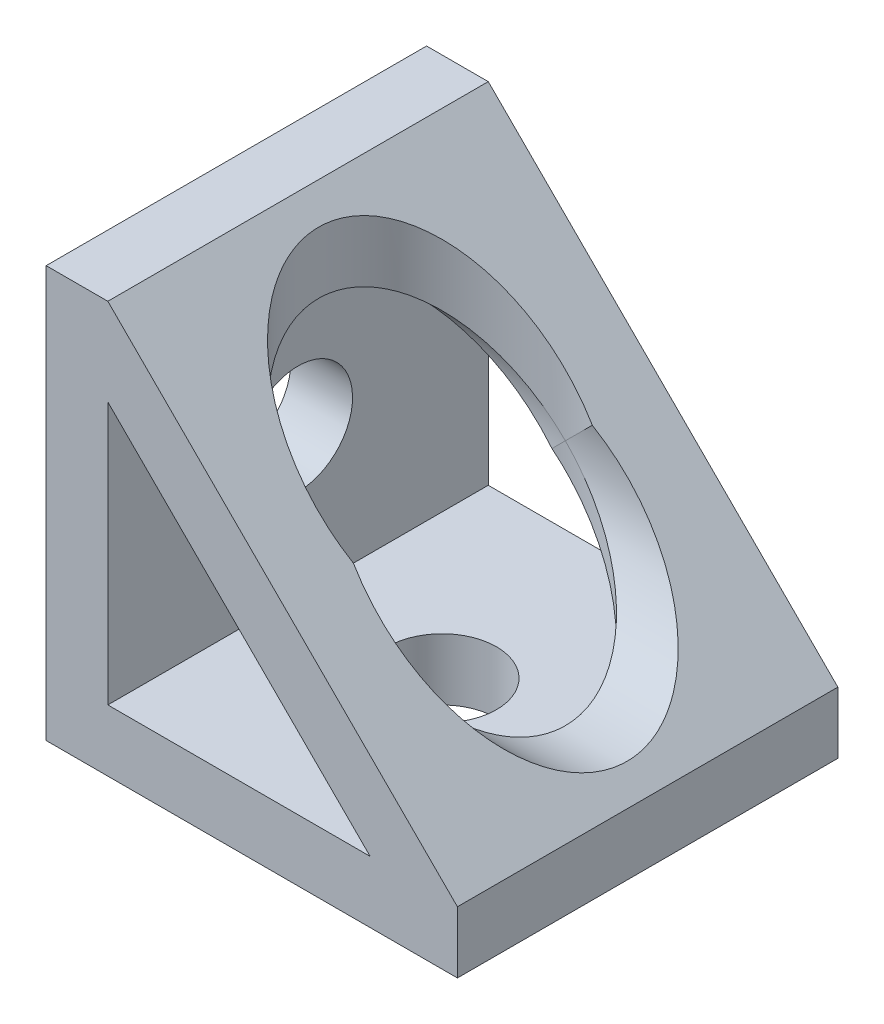
ISO-10303-21;
HEADER;
FILE_DESCRIPTION(('STEP AP214'),'2;1');
FILE_NAME('part.step','',(''),(''),'','','');
FILE_SCHEMA(('AUTOMOTIVE_DESIGN { 1 0 10303 214 1 1 1 1 }'));
ENDSEC;
DATA;
#1=APPLICATION_CONTEXT('core data for automotive mechanical design processes');
#2=APPLICATION_PROTOCOL_DEFINITION('international standard','automotive_design',2000,#1);
#3=PRODUCT_CONTEXT('',#1,'mechanical');
#4=PRODUCT('Part','Part','',(#3));
#5=PRODUCT_RELATED_PRODUCT_CATEGORY('part','',(#4));
#6=PRODUCT_DEFINITION_FORMATION('','',#4);
#7=PRODUCT_DEFINITION_CONTEXT('part definition',#1,'design');
#8=PRODUCT_DEFINITION('design','',#6,#7);
#9=PRODUCT_DEFINITION_SHAPE('','',#8);
#10=(LENGTH_UNIT() NAMED_UNIT(*) SI_UNIT(.MILLI.,.METRE.));
#11=(NAMED_UNIT(*) PLANE_ANGLE_UNIT() SI_UNIT($,.RADIAN.));
#12=(NAMED_UNIT(*) SI_UNIT($,.STERADIAN.) SOLID_ANGLE_UNIT());
#13=UNCERTAINTY_MEASURE_WITH_UNIT(LENGTH_MEASURE(1.E-05),#10,'distance_accuracy_value','');
#14=(GEOMETRIC_REPRESENTATION_CONTEXT(3) GLOBAL_UNCERTAINTY_ASSIGNED_CONTEXT((#13)) GLOBAL_UNIT_ASSIGNED_CONTEXT((#10,
#11,#12)) REPRESENTATION_CONTEXT('',''));
#15=CARTESIAN_POINT('',(0.,0.,0.));
#16=DIRECTION('',(0.,0.,1.));
#17=DIRECTION('',(1.,0.,0.));
#18=AXIS2_PLACEMENT_3D('',#15,#16,#17);
#19=CARTESIAN_POINT('',(5.75735931288072,-7.,-9.25));
#20=DIRECTION('',(0.707106781186547,0.707106781186547,0.));
#21=DIRECTION('',(-0.707106781186548,0.707106781186548,0.));
#22=AXIS2_PLACEMENT_3D('',#19,#20,#21);
#23=PLANE('',#22);
#24=DIRECTION('',(0.,0.,1.));
#25=VECTOR('',#24,1.);
#26=CARTESIAN_POINT('',(-7.,5.75735931288071,-9.25));
#27=LINE('',#26,#25);
#28=CARTESIAN_POINT('',(-7.,5.75735931288071,1.68902745459798));
#29=VERTEX_POINT('',#28);
#30=CARTESIAN_POINT('',(-7.,5.75735931288071,9.25));
#31=VERTEX_POINT('',#30);
#32=EDGE_CURVE('E143',#29,#31,#27,.T.);
#33=ORIENTED_EDGE('',*,*,#32,.F.);
#34=CARTESIAN_POINT('',(-1.24264068711928,0.,0.));
#35=DIRECTION('',(0.707106781186547,0.707106781186547,0.));
#36=DIRECTION('',(-0.707106781186548,0.707106781186548,0.));
#37=AXIS2_PLACEMENT_3D('',#34,#35,#36);
#38=ELLIPSE('',#37,8.48528137423857,6.);
#39=CARTESIAN_POINT('',(-0.621320343559641,-0.621320343559641,5.96774337842027));
#40=VERTEX_POINT('',#39);
#41=EDGE_CURVE('E126',#29,#40,#38,.T.);
#42=ORIENTED_EDGE('',*,*,#41,.T.);
#43=CARTESIAN_POINT('',(0.,-1.24264068711928,0.));
#44=DIRECTION('',(0.707106781186547,0.707106781186547,0.));
#45=DIRECTION('',(0.707106781186548,-0.707106781186548,0.));
#46=AXIS2_PLACEMENT_3D('',#43,#44,#45);
#47=ELLIPSE('',#46,8.48528137423857,6.);
#48=CARTESIAN_POINT('',(5.75735931288072,-7.,1.68902745459797));
#49=VERTEX_POINT('',#48);
#50=EDGE_CURVE('E206',#49,#40,#47,.F.);
#51=ORIENTED_EDGE('',*,*,#50,.F.);
#52=DIRECTION('',(0.,0.,1.));
#53=VECTOR('',#52,1.);
#54=CARTESIAN_POINT('',(5.75735931288072,-7.,-9.25));
#55=LINE('',#54,#53);
#56=CARTESIAN_POINT('',(5.75735931288072,-7.,9.25));
#57=VERTEX_POINT('',#56);
#58=EDGE_CURVE('E243',#49,#57,#55,.T.);
#59=ORIENTED_EDGE('',*,*,#58,.T.);
#60=DIRECTION('',(-0.707106781186547,0.707106781186547,0.));
#61=VECTOR('',#60,1.);
#62=CARTESIAN_POINT('',(5.75735931288072,-7.,9.25));
#63=LINE('',#62,#61);
#64=EDGE_CURVE('E150',#57,#31,#63,.T.);
#65=ORIENTED_EDGE('',*,*,#64,.T.);
#66=EDGE_LOOP('',(#33,#42,#51,#59,#65));
#67=FACE_BOUND('',#66,.T.);
#68=ADVANCED_FACE('F34',(#67),#23,.F.);
#69=CARTESIAN_POINT('',(0.,10.,0.));
#70=DIRECTION('',(0.,-1.,0.));
#71=DIRECTION('',(0.,0.,-1.));
#72=AXIS2_PLACEMENT_3D('',#69,#70,#71);
#73=CYLINDRICAL_SURFACE('',#72,6.);
#74=CARTESIAN_POINT('',(0.,0.,0.));
#75=DIRECTION('',(-0.707106781186548,-0.707106781186547,0.));
#76=DIRECTION('',(0.707106781186547,-0.707106781186548,0.));
#77=AXIS2_PLACEMENT_3D('',#74,#75,#76);
#78=ELLIPSE('',#77,8.48528137423857,6.);
#79=CARTESIAN_POINT('',(0.,0.,-6.));
#80=VERTEX_POINT('',#79);
#81=CARTESIAN_POINT('',(0.,0.,6.));
#82=VERTEX_POINT('',#81);
#83=EDGE_CURVE('E11',#80,#82,#78,.F.);
#84=ORIENTED_EDGE('',*,*,#83,.F.);
#85=CARTESIAN_POINT('',(0.,0.,0.));
#86=DIRECTION('',(0.707106781186547,-0.707106781186548,0.));
#87=DIRECTION('',(-0.707106781186548,-0.707106781186547,0.));
#88=AXIS2_PLACEMENT_3D('',#85,#86,#87);
#89=ELLIPSE('',#88,8.48528137423857,6.);
#90=CARTESIAN_POINT('',(1.5,1.5,-5.80947501931113));
#91=VERTEX_POINT('',#90);
#92=EDGE_CURVE('E180',#91,#80,#89,.F.);
#93=ORIENTED_EDGE('',*,*,#92,.F.);
#94=CARTESIAN_POINT('',(0.,3.,0.));
#95=DIRECTION('',(0.707106781186547,0.707106781186547,0.));
#96=DIRECTION('',(0.707106781186548,-0.707106781186548,0.));
#97=AXIS2_PLACEMENT_3D('',#94,#95,#96);
#98=ELLIPSE('',#97,8.48528137423857,6.);
#99=CARTESIAN_POINT('',(1.5,1.5,5.80947501931112));
#100=VERTEX_POINT('',#99);
#101=EDGE_CURVE('E202',#100,#91,#98,.F.);
#102=ORIENTED_EDGE('',*,*,#101,.F.);
#103=EDGE_CURVE('E190',#82,#100,#89,.F.);
#104=ORIENTED_EDGE('',*,*,#103,.F.);
#105=EDGE_LOOP('',(#84,#93,#102,#104));
#106=FACE_BOUND('',#105,.T.);
#107=ADVANCED_FACE('F204',(#106),#73,.F.);
#108=CARTESIAN_POINT('',(-0.621320343559641,-0.621320343559641,-5.96774337842027));
#109=VERTEX_POINT('',#108);
#110=CARTESIAN_POINT('',(5.75735931288072,-7.,-1.68902745459797));
#111=VERTEX_POINT('',#110);
#112=EDGE_CURVE('E211',#109,#111,#47,.F.);
#113=ORIENTED_EDGE('',*,*,#112,.F.);
#114=CARTESIAN_POINT('',(-7.,5.75735931288071,-1.68902745459798));
#115=VERTEX_POINT('',#114);
#116=EDGE_CURVE('E55',#109,#115,#38,.T.);
#117=ORIENTED_EDGE('',*,*,#116,.T.);
#118=CARTESIAN_POINT('',(-7.,5.75735931288071,-9.25));
#119=VERTEX_POINT('',#118);
#120=EDGE_CURVE('E146',#119,#115,#27,.T.);
#121=ORIENTED_EDGE('',*,*,#120,.F.);
#122=DIRECTION('',(-0.707106781186547,0.707106781186547,0.));
#123=VECTOR('',#122,1.);
#124=CARTESIAN_POINT('',(5.75735931288072,-7.,-9.25));
#125=LINE('',#124,#123);
#126=CARTESIAN_POINT('',(5.75735931288072,-7.,-9.25));
#127=VERTEX_POINT('',#126);
#128=EDGE_CURVE('E238',#127,#119,#125,.T.);
#129=ORIENTED_EDGE('',*,*,#128,.F.);
#130=EDGE_CURVE('E165',#127,#111,#55,.T.);
#131=ORIENTED_EDGE('',*,*,#130,.T.);
#132=EDGE_LOOP('',(#113,#117,#121,#129,#131));
#133=FACE_BOUND('',#132,.T.);
#134=ADVANCED_FACE('F270',(#133),#23,.F.);
#135=CARTESIAN_POINT('',(-7.,10.,-9.25));
#136=DIRECTION('',(0.,1.,0.));
#137=DIRECTION('',(0.,0.,1.));
#138=AXIS2_PLACEMENT_3D('',#135,#136,#137);
#139=PLANE('',#138);
#140=DIRECTION('',(0.,0.,1.));
#141=VECTOR('',#140,1.);
#142=CARTESIAN_POINT('',(-10.,10.,-9.25));
#143=LINE('',#142,#141);
#144=CARTESIAN_POINT('',(-10.,10.,-9.25));
#145=VERTEX_POINT('',#144);
#146=CARTESIAN_POINT('',(-10.,10.,9.25));
#147=VERTEX_POINT('',#146);
#148=EDGE_CURVE('E177',#145,#147,#143,.T.);
#149=ORIENTED_EDGE('',*,*,#148,.T.);
#150=DIRECTION('',(-1.,0.,0.));
#151=VECTOR('',#150,1.);
#152=CARTESIAN_POINT('',(-7.,10.,9.25));
#153=LINE('',#152,#151);
#154=CARTESIAN_POINT('',(-7.,10.,9.25));
#155=VERTEX_POINT('',#154);
#156=EDGE_CURVE('E223',#155,#147,#153,.T.);
#157=ORIENTED_EDGE('',*,*,#156,.F.);
#158=DIRECTION('',(0.,0.,1.));
#159=VECTOR('',#158,1.);
#160=CARTESIAN_POINT('',(-7.,10.,-9.25));
#161=LINE('',#160,#159);
#162=CARTESIAN_POINT('',(-7.,10.,-9.25));
#163=VERTEX_POINT('',#162);
#164=EDGE_CURVE('E178',#163,#155,#161,.T.);
#165=ORIENTED_EDGE('',*,*,#164,.F.);
#166=DIRECTION('',(-1.,0.,0.));
#167=VECTOR('',#166,1.);
#168=CARTESIAN_POINT('',(-7.,10.,-9.25));
#169=LINE('',#168,#167);
#170=EDGE_CURVE('E161',#163,#145,#169,.T.);
#171=ORIENTED_EDGE('',*,*,#170,.T.);
#172=EDGE_LOOP('',(#149,#157,#165,#171));
#173=FACE_BOUND('',#172,.T.);
#174=ADVANCED_FACE('F36',(#173),#139,.T.);
#175=CARTESIAN_POINT('',(10.,-7.,-9.25));
#176=DIRECTION('',(0.707106781186547,0.707106781186547,0.));
#177=DIRECTION('',(-0.707106781186548,0.707106781186548,0.));
#178=AXIS2_PLACEMENT_3D('',#175,#176,#177);
#179=PLANE('',#178);
#180=CARTESIAN_POINT('',(3.,0.,0.));
#181=DIRECTION('',(0.707106781186547,0.707106781186547,0.));
#182=DIRECTION('',(-0.707106781186548,0.707106781186548,0.));
#183=AXIS2_PLACEMENT_3D('',#180,#181,#182);
#184=ELLIPSE('',#183,8.48528137423857,6.);
#185=EDGE_CURVE('E147',#100,#91,#184,.T.);
#186=ORIENTED_EDGE('',*,*,#185,.F.);
#187=ORIENTED_EDGE('',*,*,#101,.T.);
#188=EDGE_LOOP('',(#186,#187));
#189=FACE_BOUND('',#188,.T.);
#190=ORIENTED_EDGE('',*,*,#164,.T.);
#191=DIRECTION('',(-0.707106781186547,0.707106781186547,0.));
#192=VECTOR('',#191,1.);
#193=CARTESIAN_POINT('',(10.,-7.,9.25));
#194=LINE('',#193,#192);
#195=CARTESIAN_POINT('',(10.,-7.,9.25));
#196=VERTEX_POINT('',#195);
#197=EDGE_CURVE('E235',#196,#155,#194,.T.);
#198=ORIENTED_EDGE('',*,*,#197,.F.);
#199=DIRECTION('',(0.,0.,1.));
#200=VECTOR('',#199,1.);
#201=CARTESIAN_POINT('',(10.,-7.,-9.25));
#202=LINE('',#201,#200);
#203=CARTESIAN_POINT('',(10.,-7.,-9.25));
#204=VERTEX_POINT('',#203);
#205=EDGE_CURVE('E181',#204,#196,#202,.T.);
#206=ORIENTED_EDGE('',*,*,#205,.F.);
#207=DIRECTION('',(-0.707106781186547,0.707106781186547,0.));
#208=VECTOR('',#207,1.);
#209=CARTESIAN_POINT('',(10.,-7.,-9.25));
#210=LINE('',#209,#208);
#211=EDGE_CURVE('E174',#204,#163,#210,.T.);
#212=ORIENTED_EDGE('',*,*,#211,.T.);
#213=EDGE_LOOP('',(#190,#198,#206,#212));
#214=FACE_BOUND('',#213,.T.);
#215=ADVANCED_FACE('F200',(#189,#214),#179,.T.);
#216=CARTESIAN_POINT('',(10.,-10.,-9.25));
#217=DIRECTION('',(1.,0.,0.));
#218=DIRECTION('',(0.,0.,-1.));
#219=AXIS2_PLACEMENT_3D('',#216,#217,#218);
#220=PLANE('',#219);
#221=ORIENTED_EDGE('',*,*,#205,.T.);
#222=DIRECTION('',(0.,1.,0.));
#223=VECTOR('',#222,1.);
#224=CARTESIAN_POINT('',(10.,-10.,9.25));
#225=LINE('',#224,#223);
#226=CARTESIAN_POINT('',(10.,-10.,9.25));
#227=VERTEX_POINT('',#226);
#228=EDGE_CURVE('E232',#227,#196,#225,.T.);
#229=ORIENTED_EDGE('',*,*,#228,.F.);
#230=DIRECTION('',(0.,0.,1.));
#231=VECTOR('',#230,1.);
#232=CARTESIAN_POINT('',(10.,-10.,-9.25));
#233=LINE('',#232,#231);
#234=CARTESIAN_POINT('',(10.,-10.,-9.25));
#235=VERTEX_POINT('',#234);
#236=EDGE_CURVE('E183',#235,#227,#233,.T.);
#237=ORIENTED_EDGE('',*,*,#236,.F.);
#238=DIRECTION('',(0.,1.,0.));
#239=VECTOR('',#238,1.);
#240=CARTESIAN_POINT('',(10.,-10.,-9.25));
#241=LINE('',#240,#239);
#242=EDGE_CURVE('E171',#235,#204,#241,.T.);
#243=ORIENTED_EDGE('',*,*,#242,.T.);
#244=EDGE_LOOP('',(#221,#229,#237,#243));
#245=FACE_BOUND('',#244,.T.);
#246=ADVANCED_FACE('F316',(#245),#220,.T.);
#247=CARTESIAN_POINT('',(-10.,-10.,-9.25));
#248=DIRECTION('',(0.,-1.,0.));
#249=DIRECTION('',(0.,0.,-1.));
#250=AXIS2_PLACEMENT_3D('',#247,#248,#249);
#251=PLANE('',#250);
#252=CARTESIAN_POINT('',(0.,-10.,0.));
#253=DIRECTION('',(0.,-1.,0.));
#254=DIRECTION('',(0.,0.,-1.));
#255=AXIS2_PLACEMENT_3D('',#252,#253,#254);
#256=CIRCLE('',#255,2.65);
#257=CARTESIAN_POINT('',(0.,-10.,-2.65));
#258=VERTEX_POINT('',#257);
#259=EDGE_CURVE('E209',#258,#258,#256,.T.);
#260=ORIENTED_EDGE('',*,*,#259,.F.);
#261=EDGE_LOOP('',(#260));
#262=FACE_BOUND('',#261,.T.);
#263=ORIENTED_EDGE('',*,*,#236,.T.);
#264=DIRECTION('',(1.,0.,0.));
#265=VECTOR('',#264,1.);
#266=CARTESIAN_POINT('',(-10.,-10.,9.25));
#267=LINE('',#266,#265);
#268=CARTESIAN_POINT('',(-10.,-10.,9.25));
#269=VERTEX_POINT('',#268);
#270=EDGE_CURVE('E229',#269,#227,#267,.T.);
#271=ORIENTED_EDGE('',*,*,#270,.F.);
#272=DIRECTION('',(0.,0.,1.));
#273=VECTOR('',#272,1.);
#274=CARTESIAN_POINT('',(-10.,-10.,-9.25));
#275=LINE('',#274,#273);
#276=CARTESIAN_POINT('',(-10.,-10.,-9.25));
#277=VERTEX_POINT('',#276);
#278=EDGE_CURVE('E185',#277,#269,#275,.T.);
#279=ORIENTED_EDGE('',*,*,#278,.F.);
#280=DIRECTION('',(1.,0.,0.));
#281=VECTOR('',#280,1.);
#282=CARTESIAN_POINT('',(-10.,-10.,-9.25));
#283=LINE('',#282,#281);
#284=EDGE_CURVE('E168',#277,#235,#283,.T.);
#285=ORIENTED_EDGE('',*,*,#284,.T.);
#286=EDGE_LOOP('',(#263,#271,#279,#285));
#287=FACE_BOUND('',#286,.T.);
#288=ADVANCED_FACE('F306',(#262,#287),#251,.T.);
#289=CARTESIAN_POINT('',(-10.,10.,-9.25));
#290=DIRECTION('',(-1.,0.,0.));
#291=DIRECTION('',(0.,-1.,0.));
#292=AXIS2_PLACEMENT_3D('',#289,#290,#291);
#293=PLANE('',#292);
#294=CARTESIAN_POINT('',(-10.,0.,0.));
#295=DIRECTION('',(1.,0.,0.));
#296=DIRECTION('',(0.,0.,-1.));
#297=AXIS2_PLACEMENT_3D('',#294,#295,#296);
#298=CIRCLE('',#297,2.65);
#299=CARTESIAN_POINT('',(-10.,0.,-2.65));
#300=VERTEX_POINT('',#299);
#301=EDGE_CURVE('E284',#300,#300,#298,.T.);
#302=ORIENTED_EDGE('',*,*,#301,.T.);
#303=EDGE_LOOP('',(#302));
#304=FACE_BOUND('',#303,.T.);
#305=ORIENTED_EDGE('',*,*,#278,.T.);
#306=DIRECTION('',(0.,-1.,0.));
#307=VECTOR('',#306,1.);
#308=CARTESIAN_POINT('',(-10.,10.,9.25));
#309=LINE('',#308,#307);
#310=EDGE_CURVE('E226',#147,#269,#309,.T.);
#311=ORIENTED_EDGE('',*,*,#310,.F.);
#312=ORIENTED_EDGE('',*,*,#148,.F.);
#313=DIRECTION('',(0.,-1.,0.));
#314=VECTOR('',#313,1.);
#315=CARTESIAN_POINT('',(-10.,10.,-9.25));
#316=LINE('',#315,#314);
#317=EDGE_CURVE('E164',#145,#277,#316,.T.);
#318=ORIENTED_EDGE('',*,*,#317,.T.);
#319=EDGE_LOOP('',(#305,#311,#312,#318));
#320=FACE_BOUND('',#319,.T.);
#321=ADVANCED_FACE('F302',(#304,#320),#293,.T.);
#322=CARTESIAN_POINT('',(0.,0.,-9.25));
#323=DIRECTION('',(0.,0.,1.));
#324=DIRECTION('',(1.,0.,0.));
#325=AXIS2_PLACEMENT_3D('',#322,#323,#324);
#326=PLANE('',#325);
#327=DIRECTION('',(1.,0.,0.));
#328=VECTOR('',#327,1.);
#329=CARTESIAN_POINT('',(-7.,-7.,-9.25));
#330=LINE('',#329,#328);
#331=CARTESIAN_POINT('',(-7.,-7.,-9.25));
#332=VERTEX_POINT('',#331);
#333=EDGE_CURVE('E152',#332,#127,#330,.T.);
#334=ORIENTED_EDGE('',*,*,#333,.T.);
#335=ORIENTED_EDGE('',*,*,#128,.T.);
#336=DIRECTION('',(0.,-1.,0.));
#337=VECTOR('',#336,1.);
#338=CARTESIAN_POINT('',(-7.,5.75735931288071,-9.25));
#339=LINE('',#338,#337);
#340=EDGE_CURVE('E156',#119,#332,#339,.T.);
#341=ORIENTED_EDGE('',*,*,#340,.T.);
#342=EDGE_LOOP('',(#334,#335,#341));
#343=FACE_BOUND('',#342,.T.);
#344=ORIENTED_EDGE('',*,*,#170,.F.);
#345=ORIENTED_EDGE('',*,*,#211,.F.);
#346=ORIENTED_EDGE('',*,*,#242,.F.);
#347=ORIENTED_EDGE('',*,*,#284,.F.);
#348=ORIENTED_EDGE('',*,*,#317,.F.);
#349=EDGE_LOOP('',(#344,#345,#346,#347,#348));
#350=FACE_BOUND('',#349,.T.);
#351=ADVANCED_FACE('F305',(#343,#350),#326,.F.);
#352=CARTESIAN_POINT('',(-7.,-7.,-9.25));
#353=DIRECTION('',(0.,-1.,0.));
#354=DIRECTION('',(0.,0.,-1.));
#355=AXIS2_PLACEMENT_3D('',#352,#353,#354);
#356=PLANE('',#355);
#357=ORIENTED_EDGE('',*,*,#58,.F.);
#358=CARTESIAN_POINT('',(0.,-7.,0.));
#359=DIRECTION('',(0.,1.,0.));
#360=DIRECTION('',(0.,0.,1.));
#361=AXIS2_PLACEMENT_3D('',#358,#359,#360);
#362=CIRCLE('',#361,6.);
#363=EDGE_CURVE('E283',#49,#111,#362,.T.);
#364=ORIENTED_EDGE('',*,*,#363,.T.);
#365=ORIENTED_EDGE('',*,*,#130,.F.);
#366=ORIENTED_EDGE('',*,*,#333,.F.);
#367=DIRECTION('',(0.,0.,1.));
#368=VECTOR('',#367,1.);
#369=CARTESIAN_POINT('',(-7.,-7.,-9.25));
#370=LINE('',#369,#368);
#371=CARTESIAN_POINT('',(-7.,-7.,9.25));
#372=VERTEX_POINT('',#371);
#373=EDGE_CURVE('E154',#332,#372,#370,.T.);
#374=ORIENTED_EDGE('',*,*,#373,.T.);
#375=DIRECTION('',(1.,0.,0.));
#376=VECTOR('',#375,1.);
#377=CARTESIAN_POINT('',(-7.,-7.,9.25));
#378=LINE('',#377,#376);
#379=EDGE_CURVE('E220',#372,#57,#378,.T.);
#380=ORIENTED_EDGE('',*,*,#379,.T.);
#381=EDGE_LOOP('',(#357,#364,#365,#366,#374,#380));
#382=FACE_BOUND('',#381,.T.);
#383=CARTESIAN_POINT('',(0.,-7.,0.));
#384=DIRECTION('',(0.,-1.,0.));
#385=DIRECTION('',(0.,0.,-1.));
#386=AXIS2_PLACEMENT_3D('',#383,#384,#385);
#387=CIRCLE('',#386,2.65);
#388=CARTESIAN_POINT('',(0.,-7.,-2.65));
#389=VERTEX_POINT('',#388);
#390=EDGE_CURVE('E205',#389,#389,#387,.F.);
#391=ORIENTED_EDGE('',*,*,#390,.F.);
#392=EDGE_LOOP('',(#391));
#393=FACE_BOUND('',#392,.T.);
#394=ADVANCED_FACE('F250',(#382,#393),#356,.F.);
#395=CARTESIAN_POINT('',(-7.,5.75735931288071,-9.25));
#396=DIRECTION('',(-1.,0.,0.));
#397=DIRECTION('',(0.,-1.,0.));
#398=AXIS2_PLACEMENT_3D('',#395,#396,#397);
#399=PLANE('',#398);
#400=ORIENTED_EDGE('',*,*,#120,.T.);
#401=CARTESIAN_POINT('',(-7.,0.,0.));
#402=DIRECTION('',(-1.,0.,0.));
#403=DIRECTION('',(0.,0.,1.));
#404=AXIS2_PLACEMENT_3D('',#401,#402,#403);
#405=CIRCLE('',#404,6.);
#406=EDGE_CURVE('E129',#29,#115,#405,.T.);
#407=ORIENTED_EDGE('',*,*,#406,.F.);
#408=ORIENTED_EDGE('',*,*,#32,.T.);
#409=DIRECTION('',(0.,-1.,0.));
#410=VECTOR('',#409,1.);
#411=CARTESIAN_POINT('',(-7.,5.75735931288071,9.25));
#412=LINE('',#411,#410);
#413=EDGE_CURVE('E218',#31,#372,#412,.T.);
#414=ORIENTED_EDGE('',*,*,#413,.T.);
#415=ORIENTED_EDGE('',*,*,#373,.F.);
#416=ORIENTED_EDGE('',*,*,#340,.F.);
#417=EDGE_LOOP('',(#400,#407,#408,#414,#415,#416));
#418=FACE_BOUND('',#417,.T.);
#419=CARTESIAN_POINT('',(-7.,0.,0.));
#420=DIRECTION('',(-1.,0.,0.));
#421=DIRECTION('',(0.,-1.,0.));
#422=AXIS2_PLACEMENT_3D('',#419,#420,#421);
#423=CIRCLE('',#422,2.65);
#424=CARTESIAN_POINT('',(-7.,-2.65,0.));
#425=VERTEX_POINT('',#424);
#426=EDGE_CURVE('E136',#425,#425,#423,.T.);
#427=ORIENTED_EDGE('',*,*,#426,.T.);
#428=EDGE_LOOP('',(#427));
#429=FACE_BOUND('',#428,.T.);
#430=ADVANCED_FACE('F140',(#418,#429),#399,.F.);
#431=CARTESIAN_POINT('',(0.,0.,9.25));
#432=DIRECTION('',(0.,0.,1.));
#433=DIRECTION('',(1.,0.,0.));
#434=AXIS2_PLACEMENT_3D('',#431,#432,#433);
#435=PLANE('',#434);
#436=ORIENTED_EDGE('',*,*,#156,.T.);
#437=ORIENTED_EDGE('',*,*,#310,.T.);
#438=ORIENTED_EDGE('',*,*,#270,.T.);
#439=ORIENTED_EDGE('',*,*,#228,.T.);
#440=ORIENTED_EDGE('',*,*,#197,.T.);
#441=EDGE_LOOP('',(#436,#437,#438,#439,#440));
#442=FACE_BOUND('',#441,.T.);
#443=ORIENTED_EDGE('',*,*,#413,.F.);
#444=ORIENTED_EDGE('',*,*,#64,.F.);
#445=ORIENTED_EDGE('',*,*,#379,.F.);
#446=EDGE_LOOP('',(#443,#444,#445));
#447=FACE_BOUND('',#446,.T.);
#448=ADVANCED_FACE('F254',(#442,#447),#435,.T.);
#449=CARTESIAN_POINT('',(0.,10.001,0.));
#450=DIRECTION('',(0.,-1.,0.));
#451=DIRECTION('',(0.,0.,-1.));
#452=AXIS2_PLACEMENT_3D('',#449,#450,#451);
#453=CYLINDRICAL_SURFACE('',#452,2.65);
#454=ORIENTED_EDGE('',*,*,#259,.T.);
#455=EDGE_LOOP('',(#454));
#456=FACE_BOUND('',#455,.T.);
#457=ORIENTED_EDGE('',*,*,#390,.T.);
#458=EDGE_LOOP('',(#457));
#459=FACE_BOUND('',#458,.T.);
#460=ADVANCED_FACE('F256',(#456,#459),#453,.F.);
#461=CARTESIAN_POINT('',(0.,0.,0.));
#462=DIRECTION('',(-0.707106781186548,-0.707106781186547,0.));
#463=DIRECTION('',(0.707106781186547,-0.707106781186548,0.));
#464=AXIS2_PLACEMENT_3D('',#461,#462,#463);
#465=ELLIPSE('',#464,8.48528137423857,6.);
#466=EDGE_CURVE('E42',#80,#82,#465,.T.);
#467=ORIENTED_EDGE('',*,*,#466,.F.);
#468=CARTESIAN_POINT('',(0.,0.,0.));
#469=DIRECTION('',(0.707106781186547,-0.707106781186548,0.));
#470=DIRECTION('',(-0.707106781186548,-0.707106781186547,0.));
#471=AXIS2_PLACEMENT_3D('',#468,#469,#470);
#472=ELLIPSE('',#471,8.48528137423857,6.);
#473=EDGE_CURVE('E189',#109,#80,#472,.T.);
#474=ORIENTED_EDGE('',*,*,#473,.F.);
#475=ORIENTED_EDGE('',*,*,#112,.T.);
#476=ORIENTED_EDGE('',*,*,#363,.F.);
#477=ORIENTED_EDGE('',*,*,#50,.T.);
#478=EDGE_CURVE('E131',#82,#40,#472,.T.);
#479=ORIENTED_EDGE('',*,*,#478,.F.);
#480=EDGE_LOOP('',(#467,#474,#475,#476,#477,#479));
#481=FACE_BOUND('',#480,.T.);
#482=ADVANCED_FACE('F263',(#481),#73,.F.);
#483=CARTESIAN_POINT('',(10.001,0.,0.));
#484=DIRECTION('',(-1.,0.,0.));
#485=DIRECTION('',(0.,-1.,0.));
#486=AXIS2_PLACEMENT_3D('',#483,#484,#485);
#487=CYLINDRICAL_SURFACE('',#486,2.65);
#488=ORIENTED_EDGE('',*,*,#301,.F.);
#489=EDGE_LOOP('',(#488));
#490=FACE_BOUND('',#489,.T.);
#491=ORIENTED_EDGE('',*,*,#426,.F.);
#492=EDGE_LOOP('',(#491));
#493=FACE_BOUND('',#492,.T.);
#494=ADVANCED_FACE('F291',(#490,#493),#487,.F.);
#495=CARTESIAN_POINT('',(10.,0.,0.));
#496=DIRECTION('',(-1.,0.,0.));
#497=DIRECTION('',(0.,-1.,0.));
#498=AXIS2_PLACEMENT_3D('',#495,#496,#497);
#499=CYLINDRICAL_SURFACE('',#498,6.);
#500=ORIENTED_EDGE('',*,*,#466,.T.);
#501=ORIENTED_EDGE('',*,*,#103,.T.);
#502=ORIENTED_EDGE('',*,*,#185,.T.);
#503=ORIENTED_EDGE('',*,*,#92,.T.);
#504=EDGE_LOOP('',(#500,#501,#502,#503));
#505=FACE_BOUND('',#504,.T.);
#506=ADVANCED_FACE('F193',(#505),#499,.F.);
#507=ORIENTED_EDGE('',*,*,#83,.T.);
#508=ORIENTED_EDGE('',*,*,#478,.T.);
#509=ORIENTED_EDGE('',*,*,#41,.F.);
#510=ORIENTED_EDGE('',*,*,#406,.T.);
#511=ORIENTED_EDGE('',*,*,#116,.F.);
#512=ORIENTED_EDGE('',*,*,#473,.T.);
#513=EDGE_LOOP('',(#507,#508,#509,#510,#511,#512));
#514=FACE_BOUND('',#513,.T.);
#515=ADVANCED_FACE('F128',(#514),#499,.F.);
#516=CLOSED_SHELL('',(#68,#107,#134,#174,#215,#246,#288,#321,#351,#394,#430,#448,#460,#482,#494,
#506,#515));
#517=MANIFOLD_SOLID_BREP('B2',#516);
#518=ADVANCED_BREP_SHAPE_REPRESENTATION('',(#18,#517),#14);
#519=SHAPE_DEFINITION_REPRESENTATION(#9,#518);
ENDSEC;
END-ISO-10303-21;
